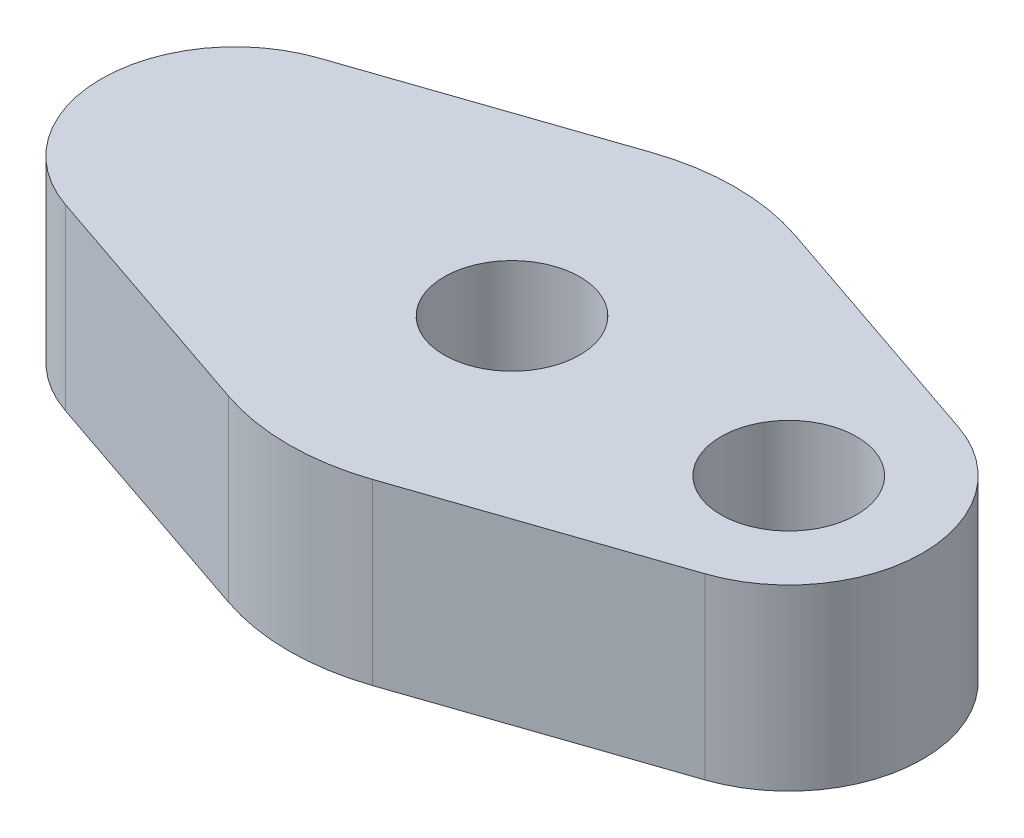
ISO-10303-21;
HEADER;
FILE_DESCRIPTION(('STEP AP214'),'2;1');
FILE_NAME('part.step','',(''),(''),'','','');
FILE_SCHEMA(('AUTOMOTIVE_DESIGN { 1 0 10303 214 1 1 1 1 }'));
ENDSEC;
DATA;
#1=APPLICATION_CONTEXT('core data for automotive mechanical design processes');
#2=APPLICATION_PROTOCOL_DEFINITION('international standard','automotive_design',2000,#1);
#3=PRODUCT_CONTEXT('',#1,'mechanical');
#4=PRODUCT('Part','Part','',(#3));
#5=PRODUCT_RELATED_PRODUCT_CATEGORY('part','',(#4));
#6=PRODUCT_DEFINITION_FORMATION('','',#4);
#7=PRODUCT_DEFINITION_CONTEXT('part definition',#1,'design');
#8=PRODUCT_DEFINITION('design','',#6,#7);
#9=PRODUCT_DEFINITION_SHAPE('','',#8);
#10=(LENGTH_UNIT() NAMED_UNIT(*) SI_UNIT(.MILLI.,.METRE.));
#11=(NAMED_UNIT(*) PLANE_ANGLE_UNIT() SI_UNIT($,.RADIAN.));
#12=(NAMED_UNIT(*) SI_UNIT($,.STERADIAN.) SOLID_ANGLE_UNIT());
#13=UNCERTAINTY_MEASURE_WITH_UNIT(LENGTH_MEASURE(1.E-05),#10,'distance_accuracy_value','');
#14=(GEOMETRIC_REPRESENTATION_CONTEXT(3) GLOBAL_UNCERTAINTY_ASSIGNED_CONTEXT((#13)) GLOBAL_UNIT_ASSIGNED_CONTEXT((#10,
#11,#12)) REPRESENTATION_CONTEXT('',''));
#15=CARTESIAN_POINT('',(0.,0.,0.));
#16=DIRECTION('',(0.,0.,1.));
#17=DIRECTION('',(1.,0.,0.));
#18=AXIS2_PLACEMENT_3D('',#15,#16,#17);
#19=CARTESIAN_POINT('',(-2.01612903225807,5.,-5.91588739964565));
#20=DIRECTION('',(-0.32258064516129,0.,-0.946541983943304));
#21=DIRECTION('',(-0.946541983943304,0.,0.32258064516129));
#22=AXIS2_PLACEMENT_3D('',#19,#20,#21);
#23=PLANE('',#22);
#24=DIRECTION('',(0.946541983943304,0.,-0.32258064516129));
#25=VECTOR('',#24,1.);
#26=CARTESIAN_POINT('',(-2.01612903225807,0.,-5.91588739964565));
#27=LINE('',#26,#25);
#28=CARTESIAN_POINT('',(-8.95967741935484,0.,-3.54953243978739));
#29=VERTEX_POINT('',#28);
#30=CARTESIAN_POINT('',(-2.01612903225806,0.,-5.91588739964565));
#31=VERTEX_POINT('',#30);
#32=EDGE_CURVE('E128',#29,#31,#27,.T.);
#33=ORIENTED_EDGE('',*,*,#32,.F.);
#34=DIRECTION('',(0.,-1.,0.));
#35=VECTOR('',#34,1.);
#36=CARTESIAN_POINT('',(-8.95967741935484,5.,-3.54953243978739));
#37=LINE('',#36,#35);
#38=CARTESIAN_POINT('',(-8.95967741935484,5.,-3.54953243978739));
#39=VERTEX_POINT('',#38);
#40=EDGE_CURVE('E11',#39,#29,#37,.T.);
#41=ORIENTED_EDGE('',*,*,#40,.F.);
#42=DIRECTION('',(0.946541983943304,0.,-0.32258064516129));
#43=VECTOR('',#42,1.);
#44=CARTESIAN_POINT('',(-2.01612903225807,5.,-5.91588739964565));
#45=LINE('',#44,#43);
#46=CARTESIAN_POINT('',(-2.01612903225806,5.,-5.91588739964565));
#47=VERTEX_POINT('',#46);
#48=EDGE_CURVE('E175',#39,#47,#45,.T.);
#49=ORIENTED_EDGE('',*,*,#48,.T.);
#50=DIRECTION('',(0.,-1.,0.));
#51=VECTOR('',#50,1.);
#52=CARTESIAN_POINT('',(-2.01612903225806,5.,-5.91588739964565));
#53=LINE('',#52,#51);
#54=EDGE_CURVE('E84',#47,#31,#53,.T.);
#55=ORIENTED_EDGE('',*,*,#54,.T.);
#56=EDGE_LOOP('',(#33,#41,#49,#55));
#57=FACE_BOUND('',#56,.T.);
#58=ADVANCED_FACE('F34',(#57),#23,.T.);
#59=CARTESIAN_POINT('',(-7.75,5.,0.));
#60=DIRECTION('',(0.,-1.,0.));
#61=DIRECTION('',(0.,0.,-1.));
#62=AXIS2_PLACEMENT_3D('',#59,#60,#61);
#63=CYLINDRICAL_SURFACE('',#62,3.75);
#64=CARTESIAN_POINT('',(-7.75,0.,0.));
#65=DIRECTION('',(0.,1.,0.));
#66=DIRECTION('',(0.,0.,1.));
#67=AXIS2_PLACEMENT_3D('',#64,#65,#66);
#68=CIRCLE('',#67,3.75);
#69=CARTESIAN_POINT('',(-8.95967741935484,0.,3.54953243978739));
#70=VERTEX_POINT('',#69);
#71=EDGE_CURVE('E131',#29,#70,#68,.T.);
#72=ORIENTED_EDGE('',*,*,#71,.T.);
#73=DIRECTION('',(0.,-1.,0.));
#74=VECTOR('',#73,1.);
#75=CARTESIAN_POINT('',(-8.95967741935484,5.,3.54953243978739));
#76=LINE('',#75,#74);
#77=CARTESIAN_POINT('',(-8.95967741935484,5.,3.54953243978739));
#78=VERTEX_POINT('',#77);
#79=EDGE_CURVE('E42',#78,#70,#76,.T.);
#80=ORIENTED_EDGE('',*,*,#79,.F.);
#81=CARTESIAN_POINT('',(-7.75,5.,0.));
#82=DIRECTION('',(0.,1.,0.));
#83=DIRECTION('',(0.,0.,1.));
#84=AXIS2_PLACEMENT_3D('',#81,#82,#83);
#85=CIRCLE('',#84,3.75);
#86=EDGE_CURVE('E171',#39,#78,#85,.T.);
#87=ORIENTED_EDGE('',*,*,#86,.F.);
#88=ORIENTED_EDGE('',*,*,#40,.T.);
#89=EDGE_LOOP('',(#72,#80,#87,#88));
#90=FACE_BOUND('',#89,.T.);
#91=ADVANCED_FACE('F211',(#90),#63,.T.);
#92=CARTESIAN_POINT('',(-2.01612903225806,5.,5.91588739964565));
#93=DIRECTION('',(0.32258064516129,0.,-0.946541983943304));
#94=DIRECTION('',(-0.946541983943304,0.,-0.32258064516129));
#95=AXIS2_PLACEMENT_3D('',#92,#93,#94);
#96=PLANE('',#95);
#97=DIRECTION('',(0.946541983943304,0.,0.32258064516129));
#98=VECTOR('',#97,1.);
#99=CARTESIAN_POINT('',(-2.01612903225806,0.,5.91588739964565));
#100=LINE('',#99,#98);
#101=CARTESIAN_POINT('',(-2.01612903225806,0.,5.91588739964565));
#102=VERTEX_POINT('',#101);
#103=EDGE_CURVE('E134',#70,#102,#100,.T.);
#104=ORIENTED_EDGE('',*,*,#103,.T.);
#105=DIRECTION('',(0.,-1.,0.));
#106=VECTOR('',#105,1.);
#107=CARTESIAN_POINT('',(-2.01612903225806,5.,5.91588739964565));
#108=LINE('',#107,#106);
#109=CARTESIAN_POINT('',(-2.01612903225806,5.,5.91588739964565));
#110=VERTEX_POINT('',#109);
#111=EDGE_CURVE('E151',#110,#102,#108,.T.);
#112=ORIENTED_EDGE('',*,*,#111,.F.);
#113=DIRECTION('',(0.946541983943304,0.,0.32258064516129));
#114=VECTOR('',#113,1.);
#115=CARTESIAN_POINT('',(-2.01612903225806,5.,5.91588739964565));
#116=LINE('',#115,#114);
#117=EDGE_CURVE('E160',#78,#110,#116,.T.);
#118=ORIENTED_EDGE('',*,*,#117,.F.);
#119=ORIENTED_EDGE('',*,*,#79,.T.);
#120=EDGE_LOOP('',(#104,#112,#118,#119));
#121=FACE_BOUND('',#120,.T.);
#122=ADVANCED_FACE('F158',(#121),#96,.F.);
#123=CARTESIAN_POINT('',(0.,5.,0.));
#124=DIRECTION('',(0.,-1.,0.));
#125=DIRECTION('',(0.,0.,-1.));
#126=AXIS2_PLACEMENT_3D('',#123,#124,#125);
#127=CYLINDRICAL_SURFACE('',#126,6.25);
#128=CARTESIAN_POINT('',(0.,0.,0.));
#129=DIRECTION('',(0.,1.,0.));
#130=DIRECTION('',(0.,0.,1.));
#131=AXIS2_PLACEMENT_3D('',#128,#129,#130);
#132=CIRCLE('',#131,6.25);
#133=CARTESIAN_POINT('',(2.01612903225806,0.,5.91588739964565));
#134=VERTEX_POINT('',#133);
#135=EDGE_CURVE('E136',#102,#134,#132,.T.);
#136=ORIENTED_EDGE('',*,*,#135,.T.);
#137=DIRECTION('',(0.,-1.,0.));
#138=VECTOR('',#137,1.);
#139=CARTESIAN_POINT('',(2.01612903225806,5.,5.91588739964565));
#140=LINE('',#139,#138);
#141=CARTESIAN_POINT('',(2.01612903225806,5.,5.91588739964565));
#142=VERTEX_POINT('',#141);
#143=EDGE_CURVE('E149',#142,#134,#140,.T.);
#144=ORIENTED_EDGE('',*,*,#143,.F.);
#145=CARTESIAN_POINT('',(0.,5.,0.));
#146=DIRECTION('',(0.,1.,0.));
#147=DIRECTION('',(0.,0.,1.));
#148=AXIS2_PLACEMENT_3D('',#145,#146,#147);
#149=CIRCLE('',#148,6.25);
#150=EDGE_CURVE('E125',#110,#142,#149,.T.);
#151=ORIENTED_EDGE('',*,*,#150,.F.);
#152=ORIENTED_EDGE('',*,*,#111,.T.);
#153=EDGE_LOOP('',(#136,#144,#151,#152));
#154=FACE_BOUND('',#153,.T.);
#155=ADVANCED_FACE('F169',(#154),#127,.T.);
#156=CARTESIAN_POINT('',(2.01612903225806,5.,5.91588739964565));
#157=DIRECTION('',(0.32258064516129,0.,0.946541983943304));
#158=DIRECTION('',(0.946541983943304,0.,-0.32258064516129));
#159=AXIS2_PLACEMENT_3D('',#156,#157,#158);
#160=PLANE('',#159);
#161=DIRECTION('',(-0.946541983943304,0.,0.32258064516129));
#162=VECTOR('',#161,1.);
#163=CARTESIAN_POINT('',(2.01612903225806,0.,5.91588739964565));
#164=LINE('',#163,#162);
#165=CARTESIAN_POINT('',(8.95967741935484,0.,3.54953243978739));
#166=VERTEX_POINT('',#165);
#167=EDGE_CURVE('E139',#166,#134,#164,.T.);
#168=ORIENTED_EDGE('',*,*,#167,.F.);
#169=DIRECTION('',(0.,-1.,0.));
#170=VECTOR('',#169,1.);
#171=CARTESIAN_POINT('',(8.95967741935484,5.,3.54953243978739));
#172=LINE('',#171,#170);
#173=CARTESIAN_POINT('',(8.95967741935484,5.,3.54953243978739));
#174=VERTEX_POINT('',#173);
#175=EDGE_CURVE('E120',#174,#166,#172,.T.);
#176=ORIENTED_EDGE('',*,*,#175,.F.);
#177=DIRECTION('',(-0.946541983943304,0.,0.32258064516129));
#178=VECTOR('',#177,1.);
#179=CARTESIAN_POINT('',(2.01612903225806,5.,5.91588739964565));
#180=LINE('',#179,#178);
#181=EDGE_CURVE('E109',#174,#142,#180,.T.);
#182=ORIENTED_EDGE('',*,*,#181,.T.);
#183=ORIENTED_EDGE('',*,*,#143,.T.);
#184=EDGE_LOOP('',(#168,#176,#182,#183));
#185=FACE_BOUND('',#184,.T.);
#186=ADVANCED_FACE('F222',(#185),#160,.T.);
#187=CARTESIAN_POINT('',(7.75,5.,0.));
#188=DIRECTION('',(0.,-1.,0.));
#189=DIRECTION('',(0.,0.,-1.));
#190=AXIS2_PLACEMENT_3D('',#187,#188,#189);
#191=CYLINDRICAL_SURFACE('',#190,3.75);
#192=CARTESIAN_POINT('',(7.75,0.,0.));
#193=DIRECTION('',(0.,1.,0.));
#194=DIRECTION('',(0.,0.,1.));
#195=AXIS2_PLACEMENT_3D('',#192,#193,#194);
#196=CIRCLE('',#195,3.75);
#197=CARTESIAN_POINT('',(8.95967741935484,0.,-3.54953243978739));
#198=VERTEX_POINT('',#197);
#199=EDGE_CURVE('E116',#166,#198,#196,.T.);
#200=ORIENTED_EDGE('',*,*,#199,.T.);
#201=DIRECTION('',(0.,-1.,0.));
#202=VECTOR('',#201,1.);
#203=CARTESIAN_POINT('',(8.95967741935484,5.,-3.54953243978739));
#204=LINE('',#203,#202);
#205=CARTESIAN_POINT('',(8.95967741935484,5.,-3.54953243978739));
#206=VERTEX_POINT('',#205);
#207=EDGE_CURVE('E113',#206,#198,#204,.T.);
#208=ORIENTED_EDGE('',*,*,#207,.F.);
#209=CARTESIAN_POINT('',(7.75,5.,0.));
#210=DIRECTION('',(0.,1.,0.));
#211=DIRECTION('',(0.,0.,1.));
#212=AXIS2_PLACEMENT_3D('',#209,#210,#211);
#213=CIRCLE('',#212,3.75);
#214=EDGE_CURVE('E103',#174,#206,#213,.T.);
#215=ORIENTED_EDGE('',*,*,#214,.F.);
#216=ORIENTED_EDGE('',*,*,#175,.T.);
#217=EDGE_LOOP('',(#200,#208,#215,#216));
#218=FACE_BOUND('',#217,.T.);
#219=ADVANCED_FACE('F114',(#218),#191,.T.);
#220=CARTESIAN_POINT('',(2.01612903225807,5.,-5.91588739964565));
#221=DIRECTION('',(0.32258064516129,0.,-0.946541983943304));
#222=DIRECTION('',(-0.946541983943304,0.,-0.32258064516129));
#223=AXIS2_PLACEMENT_3D('',#220,#221,#222);
#224=PLANE('',#223);
#225=DIRECTION('',(0.946541983943304,0.,0.32258064516129));
#226=VECTOR('',#225,1.);
#227=CARTESIAN_POINT('',(2.01612903225807,0.,-5.91588739964565));
#228=LINE('',#227,#226);
#229=CARTESIAN_POINT('',(2.01612903225806,0.,-5.91588739964565));
#230=VERTEX_POINT('',#229);
#231=EDGE_CURVE('E144',#230,#198,#228,.T.);
#232=ORIENTED_EDGE('',*,*,#231,.F.);
#233=DIRECTION('',(0.,-1.,0.));
#234=VECTOR('',#233,1.);
#235=CARTESIAN_POINT('',(2.01612903225806,5.,-5.91588739964565));
#236=LINE('',#235,#234);
#237=CARTESIAN_POINT('',(2.01612903225806,5.,-5.91588739964565));
#238=VERTEX_POINT('',#237);
#239=EDGE_CURVE('E77',#238,#230,#236,.T.);
#240=ORIENTED_EDGE('',*,*,#239,.F.);
#241=DIRECTION('',(0.946541983943304,0.,0.32258064516129));
#242=VECTOR('',#241,1.);
#243=CARTESIAN_POINT('',(2.01612903225807,5.,-5.91588739964565));
#244=LINE('',#243,#242);
#245=EDGE_CURVE('E107',#238,#206,#244,.T.);
#246=ORIENTED_EDGE('',*,*,#245,.T.);
#247=ORIENTED_EDGE('',*,*,#207,.T.);
#248=EDGE_LOOP('',(#232,#240,#246,#247));
#249=FACE_BOUND('',#248,.T.);
#250=ADVANCED_FACE('F122',(#249),#224,.T.);
#251=EDGE_CURVE('E140',#230,#31,#132,.T.);
#252=ORIENTED_EDGE('',*,*,#251,.T.);
#253=ORIENTED_EDGE('',*,*,#54,.F.);
#254=EDGE_CURVE('E50',#238,#47,#149,.T.);
#255=ORIENTED_EDGE('',*,*,#254,.F.);
#256=ORIENTED_EDGE('',*,*,#239,.T.);
#257=EDGE_LOOP('',(#252,#253,#255,#256));
#258=FACE_BOUND('',#257,.T.);
#259=ADVANCED_FACE('F193',(#258),#127,.T.);
#260=CARTESIAN_POINT('',(0.,5.,0.));
#261=DIRECTION('',(0.,1.,0.));
#262=DIRECTION('',(0.,0.,1.));
#263=AXIS2_PLACEMENT_3D('',#260,#261,#262);
#264=PLANE('',#263);
#265=CARTESIAN_POINT('',(7.75,5.,0.));
#266=DIRECTION('',(0.,1.,0.));
#267=DIRECTION('',(0.,0.,1.));
#268=AXIS2_PLACEMENT_3D('',#265,#266,#267);
#269=CIRCLE('',#268,1.89864999999999);
#270=CARTESIAN_POINT('',(7.75,5.,1.89864999999999));
#271=VERTEX_POINT('',#270);
#272=EDGE_CURVE('E185',#271,#271,#269,.T.);
#273=ORIENTED_EDGE('',*,*,#272,.F.);
#274=EDGE_LOOP('',(#273));
#275=FACE_BOUND('',#274,.T.);
#276=CARTESIAN_POINT('',(0.,5.,0.));
#277=DIRECTION('',(0.,1.,0.));
#278=DIRECTION('',(0.,0.,1.));
#279=AXIS2_PLACEMENT_3D('',#276,#277,#278);
#280=CIRCLE('',#279,1.89864999999999);
#281=CARTESIAN_POINT('',(0.,5.,1.89864999999999));
#282=VERTEX_POINT('',#281);
#283=EDGE_CURVE('E179',#282,#282,#280,.T.);
#284=ORIENTED_EDGE('',*,*,#283,.F.);
#285=EDGE_LOOP('',(#284));
#286=FACE_BOUND('',#285,.T.);
#287=ORIENTED_EDGE('',*,*,#48,.F.);
#288=ORIENTED_EDGE('',*,*,#86,.T.);
#289=ORIENTED_EDGE('',*,*,#117,.T.);
#290=ORIENTED_EDGE('',*,*,#150,.T.);
#291=ORIENTED_EDGE('',*,*,#181,.F.);
#292=ORIENTED_EDGE('',*,*,#214,.T.);
#293=ORIENTED_EDGE('',*,*,#245,.F.);
#294=ORIENTED_EDGE('',*,*,#254,.T.);
#295=EDGE_LOOP('',(#287,#288,#289,#290,#291,#292,#293,#294));
#296=FACE_BOUND('',#295,.T.);
#297=ADVANCED_FACE('F105',(#275,#286,#296),#264,.T.);
#298=CARTESIAN_POINT('',(0.,0.,0.));
#299=DIRECTION('',(0.,1.,0.));
#300=DIRECTION('',(0.,0.,1.));
#301=AXIS2_PLACEMENT_3D('',#298,#299,#300);
#302=PLANE('',#301);
#303=CARTESIAN_POINT('',(7.75,0.,0.));
#304=DIRECTION('',(0.,1.,0.));
#305=DIRECTION('',(0.,0.,1.));
#306=AXIS2_PLACEMENT_3D('',#303,#304,#305);
#307=CIRCLE('',#306,1.89865);
#308=CARTESIAN_POINT('',(7.75,0.,1.89865));
#309=VERTEX_POINT('',#308);
#310=EDGE_CURVE('E182',#309,#309,#307,.T.);
#311=ORIENTED_EDGE('',*,*,#310,.T.);
#312=EDGE_LOOP('',(#311));
#313=FACE_BOUND('',#312,.T.);
#314=CARTESIAN_POINT('',(0.,0.,0.));
#315=DIRECTION('',(0.,1.,0.));
#316=DIRECTION('',(0.,0.,1.));
#317=AXIS2_PLACEMENT_3D('',#314,#315,#316);
#318=CIRCLE('',#317,1.89865);
#319=CARTESIAN_POINT('',(0.,0.,1.89865));
#320=VERTEX_POINT('',#319);
#321=EDGE_CURVE('E132',#320,#320,#318,.T.);
#322=ORIENTED_EDGE('',*,*,#321,.T.);
#323=EDGE_LOOP('',(#322));
#324=FACE_BOUND('',#323,.T.);
#325=ORIENTED_EDGE('',*,*,#32,.T.);
#326=ORIENTED_EDGE('',*,*,#251,.F.);
#327=ORIENTED_EDGE('',*,*,#231,.T.);
#328=ORIENTED_EDGE('',*,*,#199,.F.);
#329=ORIENTED_EDGE('',*,*,#167,.T.);
#330=ORIENTED_EDGE('',*,*,#135,.F.);
#331=ORIENTED_EDGE('',*,*,#103,.F.);
#332=ORIENTED_EDGE('',*,*,#71,.F.);
#333=EDGE_LOOP('',(#325,#326,#327,#328,#329,#330,#331,#332));
#334=FACE_BOUND('',#333,.T.);
#335=ADVANCED_FACE('F165',(#313,#324,#334),#302,.F.);
#336=CARTESIAN_POINT('',(0.,5.,0.));
#337=DIRECTION('',(0.,1.,0.));
#338=DIRECTION('',(0.,0.,1.));
#339=AXIS2_PLACEMENT_3D('',#336,#337,#338);
#340=CYLINDRICAL_SURFACE('',#339,1.89864999999999);
#341=ORIENTED_EDGE('',*,*,#321,.F.);
#342=EDGE_LOOP('',(#341));
#343=FACE_BOUND('',#342,.T.);
#344=ORIENTED_EDGE('',*,*,#283,.T.);
#345=EDGE_LOOP('',(#344));
#346=FACE_BOUND('',#345,.T.);
#347=ADVANCED_FACE('F197',(#343,#346),#340,.F.);
#348=CARTESIAN_POINT('',(7.75,5.,0.));
#349=DIRECTION('',(0.,1.,0.));
#350=DIRECTION('',(0.,0.,1.));
#351=AXIS2_PLACEMENT_3D('',#348,#349,#350);
#352=CYLINDRICAL_SURFACE('',#351,1.89864999999999);
#353=ORIENTED_EDGE('',*,*,#310,.F.);
#354=EDGE_LOOP('',(#353));
#355=FACE_BOUND('',#354,.T.);
#356=ORIENTED_EDGE('',*,*,#272,.T.);
#357=EDGE_LOOP('',(#356));
#358=FACE_BOUND('',#357,.T.);
#359=ADVANCED_FACE('F189',(#355,#358),#352,.F.);
#360=CLOSED_SHELL('',(#58,#91,#122,#155,#186,#219,#250,#259,#297,#335,#347,#359));
#361=MANIFOLD_SOLID_BREP('B2',#360);
#362=ADVANCED_BREP_SHAPE_REPRESENTATION('',(#18,#361),#14);
#363=SHAPE_DEFINITION_REPRESENTATION(#9,#362);
ENDSEC;
END-ISO-10303-21;
